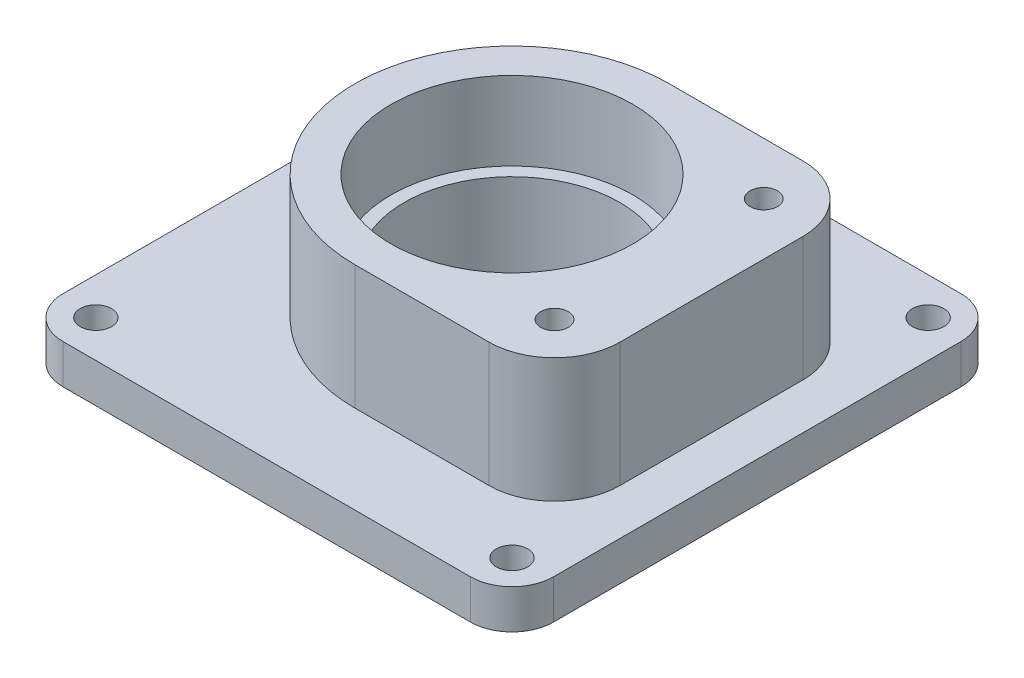
ISO-10303-21;
HEADER;
FILE_DESCRIPTION(('STEP AP214'),'2;1');
FILE_NAME('part.step','',(''),(''),'','','');
FILE_SCHEMA(('AUTOMOTIVE_DESIGN { 1 0 10303 214 1 1 1 1 }'));
ENDSEC;
DATA;
#1=APPLICATION_CONTEXT('core data for automotive mechanical design processes');
#2=APPLICATION_PROTOCOL_DEFINITION('international standard','automotive_design',2000,#1);
#3=PRODUCT_CONTEXT('',#1,'mechanical');
#4=PRODUCT('Part','Part','',(#3));
#5=PRODUCT_RELATED_PRODUCT_CATEGORY('part','',(#4));
#6=PRODUCT_DEFINITION_FORMATION('','',#4);
#7=PRODUCT_DEFINITION_CONTEXT('part definition',#1,'design');
#8=PRODUCT_DEFINITION('design','',#6,#7);
#9=PRODUCT_DEFINITION_SHAPE('','',#8);
#10=(LENGTH_UNIT() NAMED_UNIT(*) SI_UNIT(.MILLI.,.METRE.));
#11=(NAMED_UNIT(*) PLANE_ANGLE_UNIT() SI_UNIT($,.RADIAN.));
#12=(NAMED_UNIT(*) SI_UNIT($,.STERADIAN.) SOLID_ANGLE_UNIT());
#13=UNCERTAINTY_MEASURE_WITH_UNIT(LENGTH_MEASURE(1.E-05),#10,'distance_accuracy_value','');
#14=(GEOMETRIC_REPRESENTATION_CONTEXT(3) GLOBAL_UNCERTAINTY_ASSIGNED_CONTEXT((#13)) GLOBAL_UNIT_ASSIGNED_CONTEXT((#10,
#11,#12)) REPRESENTATION_CONTEXT('',''));
#15=CARTESIAN_POINT('',(0.,0.,0.));
#16=DIRECTION('',(0.,0.,1.));
#17=DIRECTION('',(1.,0.,0.));
#18=AXIS2_PLACEMENT_3D('',#15,#16,#17);
#19=CARTESIAN_POINT('',(-16.5,0.,0.));
#20=DIRECTION('',(0.,1.,0.));
#21=DIRECTION('',(0.,0.,1.));
#22=AXIS2_PLACEMENT_3D('',#19,#20,#21);
#23=PLANE('',#22);
#24=CARTESIAN_POINT('',(0.,0.,0.));
#25=DIRECTION('',(0.,-1.,0.));
#26=DIRECTION('',(0.,0.,-1.));
#27=AXIS2_PLACEMENT_3D('',#24,#25,#26);
#28=CIRCLE('',#27,16.5);
#29=CARTESIAN_POINT('',(0.,0.,-16.5));
#30=VERTEX_POINT('',#29);
#31=EDGE_CURVE('E242',#30,#30,#28,.T.);
#32=ORIENTED_EDGE('',*,*,#31,.F.);
#33=EDGE_LOOP('',(#32));
#34=FACE_BOUND('',#33,.T.);
#35=DIRECTION('',(0.,0.,1.));
#36=VECTOR('',#35,1.);
#37=CARTESIAN_POINT('',(37.5,0.,37.5));
#38=LINE('',#37,#36);
#39=CARTESIAN_POINT('',(37.5,0.,-31.15));
#40=VERTEX_POINT('',#39);
#41=CARTESIAN_POINT('',(37.5,0.,31.15));
#42=VERTEX_POINT('',#41);
#43=EDGE_CURVE('E244',#40,#42,#38,.T.);
#44=ORIENTED_EDGE('',*,*,#43,.T.);
#45=CARTESIAN_POINT('',(31.15,0.,31.15));
#46=DIRECTION('',(0.,1.,0.));
#47=DIRECTION('',(0.,0.,1.));
#48=AXIS2_PLACEMENT_3D('',#45,#46,#47);
#49=CIRCLE('',#48,6.35);
#50=CARTESIAN_POINT('',(31.15,0.,37.5));
#51=VERTEX_POINT('',#50);
#52=EDGE_CURVE('E328',#42,#51,#49,.F.);
#53=ORIENTED_EDGE('',*,*,#52,.T.);
#54=DIRECTION('',(-1.,0.,0.));
#55=VECTOR('',#54,1.);
#56=CARTESIAN_POINT('',(37.5,0.,37.5));
#57=LINE('',#56,#55);
#58=CARTESIAN_POINT('',(-31.15,0.,37.5));
#59=VERTEX_POINT('',#58);
#60=EDGE_CURVE('E238',#51,#59,#57,.T.);
#61=ORIENTED_EDGE('',*,*,#60,.T.);
#62=CARTESIAN_POINT('',(-31.15,0.,31.15));
#63=DIRECTION('',(0.,1.,0.));
#64=DIRECTION('',(0.,0.,1.));
#65=AXIS2_PLACEMENT_3D('',#62,#63,#64);
#66=CIRCLE('',#65,6.35);
#67=CARTESIAN_POINT('',(-37.5,0.,31.15));
#68=VERTEX_POINT('',#67);
#69=EDGE_CURVE('E325',#59,#68,#66,.F.);
#70=ORIENTED_EDGE('',*,*,#69,.T.);
#71=DIRECTION('',(0.,0.,-1.));
#72=VECTOR('',#71,1.);
#73=CARTESIAN_POINT('',(-37.5,0.,37.5));
#74=LINE('',#73,#72);
#75=CARTESIAN_POINT('',(-37.5,0.,-31.15));
#76=VERTEX_POINT('',#75);
#77=EDGE_CURVE('E243',#68,#76,#74,.T.);
#78=ORIENTED_EDGE('',*,*,#77,.T.);
#79=CARTESIAN_POINT('',(-31.15,0.,-31.15));
#80=DIRECTION('',(0.,1.,0.));
#81=DIRECTION('',(0.,0.,1.));
#82=AXIS2_PLACEMENT_3D('',#79,#80,#81);
#83=CIRCLE('',#82,6.35);
#84=CARTESIAN_POINT('',(-31.15,0.,-37.5));
#85=VERTEX_POINT('',#84);
#86=EDGE_CURVE('E319',#76,#85,#83,.F.);
#87=ORIENTED_EDGE('',*,*,#86,.T.);
#88=DIRECTION('',(1.,0.,0.));
#89=VECTOR('',#88,1.);
#90=CARTESIAN_POINT('',(37.5,0.,-37.5));
#91=LINE('',#90,#89);
#92=CARTESIAN_POINT('',(31.15,0.,-37.5));
#93=VERTEX_POINT('',#92);
#94=EDGE_CURVE('E248',#85,#93,#91,.T.);
#95=ORIENTED_EDGE('',*,*,#94,.T.);
#96=CARTESIAN_POINT('',(31.15,0.,-31.15));
#97=DIRECTION('',(0.,1.,0.));
#98=DIRECTION('',(0.,0.,1.));
#99=AXIS2_PLACEMENT_3D('',#96,#97,#98);
#100=CIRCLE('',#99,6.35);
#101=EDGE_CURVE('E322',#93,#40,#100,.F.);
#102=ORIENTED_EDGE('',*,*,#101,.T.);
#103=EDGE_LOOP('',(#44,#53,#61,#70,#78,#87,#95,#102));
#104=FACE_BOUND('',#103,.T.);
#105=CARTESIAN_POINT('',(31.8198051533946,0.,31.8198051533946));
#106=DIRECTION('',(0.,-1.,0.));
#107=DIRECTION('',(0.,0.,-1.));
#108=AXIS2_PLACEMENT_3D('',#105,#106,#107);
#109=CIRCLE('',#108,2.4);
#110=CARTESIAN_POINT('',(31.8198051533946,0.,29.4198051533946));
#111=VERTEX_POINT('',#110);
#112=EDGE_CURVE('E229',#111,#111,#109,.T.);
#113=ORIENTED_EDGE('',*,*,#112,.F.);
#114=EDGE_LOOP('',(#113));
#115=FACE_BOUND('',#114,.T.);
#116=CARTESIAN_POINT('',(-31.8198051533947,0.,31.8198051533946));
#117=DIRECTION('',(0.,-1.,0.));
#118=DIRECTION('',(0.,0.,-1.));
#119=AXIS2_PLACEMENT_3D('',#116,#117,#118);
#120=CIRCLE('',#119,2.4);
#121=CARTESIAN_POINT('',(-31.8198051533947,0.,29.4198051533946));
#122=VERTEX_POINT('',#121);
#123=EDGE_CURVE('E221',#122,#122,#120,.T.);
#124=ORIENTED_EDGE('',*,*,#123,.F.);
#125=EDGE_LOOP('',(#124));
#126=FACE_BOUND('',#125,.T.);
#127=CARTESIAN_POINT('',(-31.8198051533947,0.,-31.8198051533946));
#128=DIRECTION('',(0.,-1.,0.));
#129=DIRECTION('',(0.,0.,-1.));
#130=AXIS2_PLACEMENT_3D('',#127,#128,#129);
#131=CIRCLE('',#130,2.4);
#132=CARTESIAN_POINT('',(-31.8198051533947,0.,-34.2198051533946));
#133=VERTEX_POINT('',#132);
#134=EDGE_CURVE('E213',#133,#133,#131,.T.);
#135=ORIENTED_EDGE('',*,*,#134,.F.);
#136=EDGE_LOOP('',(#135));
#137=FACE_BOUND('',#136,.T.);
#138=CARTESIAN_POINT('',(31.8198051533946,0.,-31.8198051533946));
#139=DIRECTION('',(0.,-1.,0.));
#140=DIRECTION('',(0.,0.,-1.));
#141=AXIS2_PLACEMENT_3D('',#138,#139,#140);
#142=CIRCLE('',#141,2.4);
#143=CARTESIAN_POINT('',(31.8198051533946,0.,-34.2198051533946));
#144=VERTEX_POINT('',#143);
#145=EDGE_CURVE('E180',#144,#144,#142,.T.);
#146=ORIENTED_EDGE('',*,*,#145,.F.);
#147=EDGE_LOOP('',(#146));
#148=FACE_BOUND('',#147,.T.);
#149=ADVANCED_FACE('F45',(#34,#104,#115,#126,#137,#148),#23,.F.);
#150=CARTESIAN_POINT('',(-34.,6.,0.));
#151=DIRECTION('',(0.,-1.,0.));
#152=DIRECTION('',(0.,0.,-1.));
#153=AXIS2_PLACEMENT_3D('',#150,#151,#152);
#154=PLANE('',#153);
#155=CARTESIAN_POINT('',(31.8198051533946,6.,-31.8198051533946));
#156=DIRECTION('',(0.,-1.,0.));
#157=DIRECTION('',(0.,0.,-1.));
#158=AXIS2_PLACEMENT_3D('',#155,#156,#157);
#159=CIRCLE('',#158,2.4);
#160=CARTESIAN_POINT('',(31.8198051533946,6.,-34.2198051533946));
#161=VERTEX_POINT('',#160);
#162=EDGE_CURVE('E209',#161,#161,#159,.T.);
#163=ORIENTED_EDGE('',*,*,#162,.T.);
#164=EDGE_LOOP('',(#163));
#165=FACE_BOUND('',#164,.T.);
#166=CARTESIAN_POINT('',(-31.8198051533947,6.,-31.8198051533946));
#167=DIRECTION('',(0.,-1.,0.));
#168=DIRECTION('',(0.,0.,-1.));
#169=AXIS2_PLACEMENT_3D('',#166,#167,#168);
#170=CIRCLE('',#169,2.4);
#171=CARTESIAN_POINT('',(-31.8198051533947,6.,-34.2198051533946));
#172=VERTEX_POINT('',#171);
#173=EDGE_CURVE('E217',#172,#172,#170,.T.);
#174=ORIENTED_EDGE('',*,*,#173,.T.);
#175=EDGE_LOOP('',(#174));
#176=FACE_BOUND('',#175,.T.);
#177=CARTESIAN_POINT('',(-31.8198051533947,6.,31.8198051533946));
#178=DIRECTION('',(0.,-1.,0.));
#179=DIRECTION('',(0.,0.,-1.));
#180=AXIS2_PLACEMENT_3D('',#177,#178,#179);
#181=CIRCLE('',#180,2.4);
#182=CARTESIAN_POINT('',(-31.8198051533947,6.,29.4198051533946));
#183=VERTEX_POINT('',#182);
#184=EDGE_CURVE('E225',#183,#183,#181,.T.);
#185=ORIENTED_EDGE('',*,*,#184,.T.);
#186=EDGE_LOOP('',(#185));
#187=FACE_BOUND('',#186,.T.);
#188=CARTESIAN_POINT('',(31.8198051533946,6.,31.8198051533946));
#189=DIRECTION('',(0.,-1.,0.));
#190=DIRECTION('',(0.,0.,-1.));
#191=AXIS2_PLACEMENT_3D('',#188,#189,#190);
#192=CIRCLE('',#191,2.4);
#193=CARTESIAN_POINT('',(31.8198051533946,6.,29.4198051533946));
#194=VERTEX_POINT('',#193);
#195=EDGE_CURVE('E233',#194,#194,#192,.T.);
#196=ORIENTED_EDGE('',*,*,#195,.T.);
#197=EDGE_LOOP('',(#196));
#198=FACE_BOUND('',#197,.T.);
#199=CARTESIAN_POINT('',(0.,6.,0.));
#200=DIRECTION('',(0.,-1.,0.));
#201=DIRECTION('',(0.,0.,-1.));
#202=AXIS2_PLACEMENT_3D('',#199,#200,#201);
#203=CIRCLE('',#202,24.);
#204=CARTESIAN_POINT('',(0.,6.,24.));
#205=VERTEX_POINT('',#204);
#206=CARTESIAN_POINT('',(0.,6.,-24.));
#207=VERTEX_POINT('',#206);
#208=EDGE_CURVE('E289',#205,#207,#203,.T.);
#209=ORIENTED_EDGE('',*,*,#208,.T.);
#210=DIRECTION('',(-1.,0.,0.));
#211=VECTOR('',#210,1.);
#212=CARTESIAN_POINT('',(0.,6.00000000000001,-24.));
#213=LINE('',#212,#211);
#214=CARTESIAN_POINT('',(20.5,6.00000000000001,-24.));
#215=VERTEX_POINT('',#214);
#216=EDGE_CURVE('E194',#215,#207,#213,.T.);
#217=ORIENTED_EDGE('',*,*,#216,.F.);
#218=CARTESIAN_POINT('',(20.5,6.00000000000001,-14.));
#219=DIRECTION('',(0.,-1.,0.));
#220=DIRECTION('',(0.,0.,-1.));
#221=AXIS2_PLACEMENT_3D('',#218,#219,#220);
#222=CIRCLE('',#221,10.);
#223=CARTESIAN_POINT('',(30.5,6.00000000000001,-14.));
#224=VERTEX_POINT('',#223);
#225=EDGE_CURVE('E11',#215,#224,#222,.T.);
#226=ORIENTED_EDGE('',*,*,#225,.T.);
#227=DIRECTION('',(0.,0.,-1.));
#228=VECTOR('',#227,1.);
#229=CARTESIAN_POINT('',(30.5,6.00000000000001,-24.));
#230=LINE('',#229,#228);
#231=CARTESIAN_POINT('',(30.5,6.00000000000001,14.));
#232=VERTEX_POINT('',#231);
#233=EDGE_CURVE('E193',#232,#224,#230,.T.);
#234=ORIENTED_EDGE('',*,*,#233,.F.);
#235=CARTESIAN_POINT('',(20.5,6.00000000000001,14.));
#236=DIRECTION('',(0.,-1.,0.));
#237=DIRECTION('',(0.,0.,-1.));
#238=AXIS2_PLACEMENT_3D('',#235,#236,#237);
#239=CIRCLE('',#238,10.);
#240=CARTESIAN_POINT('',(20.5,6.00000000000001,24.));
#241=VERTEX_POINT('',#240);
#242=EDGE_CURVE('E54',#232,#241,#239,.T.);
#243=ORIENTED_EDGE('',*,*,#242,.T.);
#244=DIRECTION('',(1.,0.,0.));
#245=VECTOR('',#244,1.);
#246=CARTESIAN_POINT('',(30.5,6.00000000000001,24.));
#247=LINE('',#246,#245);
#248=EDGE_CURVE('E189',#205,#241,#247,.T.);
#249=ORIENTED_EDGE('',*,*,#248,.F.);
#250=EDGE_LOOP('',(#209,#217,#226,#234,#243,#249));
#251=FACE_BOUND('',#250,.T.);
#252=DIRECTION('',(1.,0.,0.));
#253=VECTOR('',#252,1.);
#254=CARTESIAN_POINT('',(37.5,6.,37.5));
#255=LINE('',#254,#253);
#256=CARTESIAN_POINT('',(-31.15,6.,37.5));
#257=VERTEX_POINT('',#256);
#258=CARTESIAN_POINT('',(31.15,6.,37.5));
#259=VERTEX_POINT('',#258);
#260=EDGE_CURVE('E259',#257,#259,#255,.T.);
#261=ORIENTED_EDGE('',*,*,#260,.T.);
#262=CARTESIAN_POINT('',(31.15,6.00000000000001,31.15));
#263=DIRECTION('',(0.,-1.,0.));
#264=DIRECTION('',(0.,0.,-1.));
#265=AXIS2_PLACEMENT_3D('',#262,#263,#264);
#266=CIRCLE('',#265,6.35);
#267=CARTESIAN_POINT('',(37.5,6.,31.15));
#268=VERTEX_POINT('',#267);
#269=EDGE_CURVE('E309',#259,#268,#266,.F.);
#270=ORIENTED_EDGE('',*,*,#269,.T.);
#271=DIRECTION('',(0.,0.,-1.));
#272=VECTOR('',#271,1.);
#273=CARTESIAN_POINT('',(37.5,6.,37.5));
#274=LINE('',#273,#272);
#275=CARTESIAN_POINT('',(37.5,6.,-31.15));
#276=VERTEX_POINT('',#275);
#277=EDGE_CURVE('E263',#268,#276,#274,.T.);
#278=ORIENTED_EDGE('',*,*,#277,.T.);
#279=CARTESIAN_POINT('',(31.15,6.00000000000001,-31.15));
#280=DIRECTION('',(0.,-1.,0.));
#281=DIRECTION('',(0.,0.,-1.));
#282=AXIS2_PLACEMENT_3D('',#279,#280,#281);
#283=CIRCLE('',#282,6.35);
#284=CARTESIAN_POINT('',(31.15,6.,-37.5));
#285=VERTEX_POINT('',#284);
#286=EDGE_CURVE('E303',#276,#285,#283,.F.);
#287=ORIENTED_EDGE('',*,*,#286,.T.);
#288=DIRECTION('',(-1.,0.,0.));
#289=VECTOR('',#288,1.);
#290=CARTESIAN_POINT('',(37.5,6.,-37.5));
#291=LINE('',#290,#289);
#292=CARTESIAN_POINT('',(-31.15,6.,-37.5));
#293=VERTEX_POINT('',#292);
#294=EDGE_CURVE('E249',#285,#293,#291,.T.);
#295=ORIENTED_EDGE('',*,*,#294,.T.);
#296=CARTESIAN_POINT('',(-31.15,6.00000000000001,-31.15));
#297=DIRECTION('',(0.,-1.,0.));
#298=DIRECTION('',(0.,0.,-1.));
#299=AXIS2_PLACEMENT_3D('',#296,#297,#298);
#300=CIRCLE('',#299,6.35);
#301=CARTESIAN_POINT('',(-37.5,6.,-31.15));
#302=VERTEX_POINT('',#301);
#303=EDGE_CURVE('E300',#293,#302,#300,.F.);
#304=ORIENTED_EDGE('',*,*,#303,.T.);
#305=DIRECTION('',(0.,0.,1.));
#306=VECTOR('',#305,1.);
#307=CARTESIAN_POINT('',(-37.5,6.,37.5));
#308=LINE('',#307,#306);
#309=CARTESIAN_POINT('',(-37.5,6.,31.15));
#310=VERTEX_POINT('',#309);
#311=EDGE_CURVE('E237',#302,#310,#308,.T.);
#312=ORIENTED_EDGE('',*,*,#311,.T.);
#313=CARTESIAN_POINT('',(-31.15,6.00000000000001,31.15));
#314=DIRECTION('',(0.,-1.,0.));
#315=DIRECTION('',(0.,0.,-1.));
#316=AXIS2_PLACEMENT_3D('',#313,#314,#315);
#317=CIRCLE('',#316,6.35);
#318=EDGE_CURVE('E306',#310,#257,#317,.F.);
#319=ORIENTED_EDGE('',*,*,#318,.T.);
#320=EDGE_LOOP('',(#261,#270,#278,#287,#295,#304,#312,#319));
#321=FACE_BOUND('',#320,.T.);
#322=ADVANCED_FACE('F365',(#165,#176,#187,#198,#251,#321),#154,.F.);
#323=CARTESIAN_POINT('',(0.,0.,0.));
#324=DIRECTION('',(0.,-1.,0.));
#325=DIRECTION('',(0.,0.,-1.));
#326=AXIS2_PLACEMENT_3D('',#323,#324,#325);
#327=CYLINDRICAL_SURFACE('',#326,24.);
#328=CARTESIAN_POINT('',(0.,25.,0.));
#329=DIRECTION('',(0.,-1.,0.));
#330=DIRECTION('',(0.,0.,-1.));
#331=AXIS2_PLACEMENT_3D('',#328,#329,#330);
#332=CIRCLE('',#331,24.);
#333=CARTESIAN_POINT('',(0.,25.,24.));
#334=VERTEX_POINT('',#333);
#335=CARTESIAN_POINT('',(0.,25.,-24.));
#336=VERTEX_POINT('',#335);
#337=EDGE_CURVE('E285',#334,#336,#332,.T.);
#338=ORIENTED_EDGE('',*,*,#337,.T.);
#339=DIRECTION('',(0.,1.,0.));
#340=VECTOR('',#339,1.);
#341=CARTESIAN_POINT('',(0.,-66.624031835199,-24.));
#342=LINE('',#341,#340);
#343=EDGE_CURVE('E197',#207,#336,#342,.T.);
#344=ORIENTED_EDGE('',*,*,#343,.F.);
#345=ORIENTED_EDGE('',*,*,#208,.F.);
#346=DIRECTION('',(0.,1.,0.));
#347=VECTOR('',#346,1.);
#348=CARTESIAN_POINT('',(0.,-66.624031835199,24.));
#349=LINE('',#348,#347);
#350=EDGE_CURVE('E176',#205,#334,#349,.T.);
#351=ORIENTED_EDGE('',*,*,#350,.T.);
#352=EDGE_LOOP('',(#338,#344,#345,#351));
#353=FACE_BOUND('',#352,.T.);
#354=ADVANCED_FACE('F387',(#353),#327,.T.);
#355=CARTESIAN_POINT('',(-24.,25.,0.));
#356=DIRECTION('',(0.,-1.,0.));
#357=DIRECTION('',(0.,0.,-1.));
#358=AXIS2_PLACEMENT_3D('',#355,#356,#357);
#359=PLANE('',#358);
#360=CARTESIAN_POINT('',(22.5,25.,-16.));
#361=DIRECTION('',(0.,1.,0.));
#362=DIRECTION('',(0.,0.,1.));
#363=AXIS2_PLACEMENT_3D('',#360,#361,#362);
#364=CIRCLE('',#363,2.1);
#365=CARTESIAN_POINT('',(22.5,25.,-13.9));
#366=VERTEX_POINT('',#365);
#367=EDGE_CURVE('E163',#366,#366,#364,.T.);
#368=ORIENTED_EDGE('',*,*,#367,.F.);
#369=EDGE_LOOP('',(#368));
#370=FACE_BOUND('',#369,.T.);
#371=CARTESIAN_POINT('',(22.5,25.,16.));
#372=DIRECTION('',(0.,1.,0.));
#373=DIRECTION('',(0.,0.,1.));
#374=AXIS2_PLACEMENT_3D('',#371,#372,#373);
#375=CIRCLE('',#374,2.1);
#376=CARTESIAN_POINT('',(22.5,25.,18.1));
#377=VERTEX_POINT('',#376);
#378=EDGE_CURVE('E162',#377,#377,#375,.T.);
#379=ORIENTED_EDGE('',*,*,#378,.F.);
#380=EDGE_LOOP('',(#379));
#381=FACE_BOUND('',#380,.T.);
#382=DIRECTION('',(1.,0.,0.));
#383=VECTOR('',#382,1.);
#384=CARTESIAN_POINT('',(30.5,25.,24.));
#385=LINE('',#384,#383);
#386=CARTESIAN_POINT('',(20.5,25.,24.));
#387=VERTEX_POINT('',#386);
#388=EDGE_CURVE('E185',#334,#387,#385,.T.);
#389=ORIENTED_EDGE('',*,*,#388,.T.);
#390=CARTESIAN_POINT('',(20.5,25.,14.));
#391=DIRECTION('',(0.,-1.,0.));
#392=DIRECTION('',(0.,0.,-1.));
#393=AXIS2_PLACEMENT_3D('',#390,#391,#392);
#394=CIRCLE('',#393,10.);
#395=CARTESIAN_POINT('',(30.5,25.,14.));
#396=VERTEX_POINT('',#395);
#397=EDGE_CURVE('E352',#387,#396,#394,.F.);
#398=ORIENTED_EDGE('',*,*,#397,.T.);
#399=DIRECTION('',(0.,0.,-1.));
#400=VECTOR('',#399,1.);
#401=CARTESIAN_POINT('',(30.5,25.,-24.));
#402=LINE('',#401,#400);
#403=CARTESIAN_POINT('',(30.5,25.,-14.));
#404=VERTEX_POINT('',#403);
#405=EDGE_CURVE('E181',#396,#404,#402,.T.);
#406=ORIENTED_EDGE('',*,*,#405,.T.);
#407=CARTESIAN_POINT('',(20.5,25.,-14.));
#408=DIRECTION('',(0.,-1.,0.));
#409=DIRECTION('',(0.,0.,-1.));
#410=AXIS2_PLACEMENT_3D('',#407,#408,#409);
#411=CIRCLE('',#410,10.);
#412=CARTESIAN_POINT('',(20.5,25.,-24.));
#413=VERTEX_POINT('',#412);
#414=EDGE_CURVE('E349',#404,#413,#411,.F.);
#415=ORIENTED_EDGE('',*,*,#414,.T.);
#416=DIRECTION('',(-1.,0.,0.));
#417=VECTOR('',#416,1.);
#418=CARTESIAN_POINT('',(0.,25.,-24.));
#419=LINE('',#418,#417);
#420=EDGE_CURVE('E177',#413,#336,#419,.T.);
#421=ORIENTED_EDGE('',*,*,#420,.T.);
#422=ORIENTED_EDGE('',*,*,#337,.F.);
#423=EDGE_LOOP('',(#389,#398,#406,#415,#421,#422));
#424=FACE_BOUND('',#423,.T.);
#425=CARTESIAN_POINT('',(0.,25.,0.));
#426=DIRECTION('',(0.,-1.,0.));
#427=DIRECTION('',(0.,0.,-1.));
#428=AXIS2_PLACEMENT_3D('',#425,#426,#427);
#429=CIRCLE('',#428,18.5);
#430=CARTESIAN_POINT('',(0.,25.,-18.5));
#431=VERTEX_POINT('',#430);
#432=EDGE_CURVE('E281',#431,#431,#429,.T.);
#433=ORIENTED_EDGE('',*,*,#432,.T.);
#434=EDGE_LOOP('',(#433));
#435=FACE_BOUND('',#434,.T.);
#436=ADVANCED_FACE('F378',(#370,#381,#424,#435),#359,.F.);
#437=CARTESIAN_POINT('',(0.,0.,0.));
#438=DIRECTION('',(0.,-1.,0.));
#439=DIRECTION('',(0.,0.,-1.));
#440=AXIS2_PLACEMENT_3D('',#437,#438,#439);
#441=CYLINDRICAL_SURFACE('',#440,18.5);
#442=ORIENTED_EDGE('',*,*,#432,.F.);
#443=EDGE_LOOP('',(#442));
#444=FACE_BOUND('',#443,.T.);
#445=CARTESIAN_POINT('',(0.,13.,0.));
#446=DIRECTION('',(0.,-1.,0.));
#447=DIRECTION('',(0.,0.,-1.));
#448=AXIS2_PLACEMENT_3D('',#445,#446,#447);
#449=CIRCLE('',#448,18.5);
#450=CARTESIAN_POINT('',(0.,13.,-18.5));
#451=VERTEX_POINT('',#450);
#452=EDGE_CURVE('E277',#451,#451,#449,.T.);
#453=ORIENTED_EDGE('',*,*,#452,.T.);
#454=EDGE_LOOP('',(#453));
#455=FACE_BOUND('',#454,.T.);
#456=ADVANCED_FACE('F394',(#444,#455),#441,.F.);
#457=CARTESIAN_POINT('',(-18.5,13.,0.));
#458=DIRECTION('',(0.,-1.,0.));
#459=DIRECTION('',(0.,0.,-1.));
#460=AXIS2_PLACEMENT_3D('',#457,#458,#459);
#461=PLANE('',#460);
#462=ORIENTED_EDGE('',*,*,#452,.F.);
#463=EDGE_LOOP('',(#462));
#464=FACE_BOUND('',#463,.T.);
#465=CARTESIAN_POINT('',(0.,13.,0.));
#466=DIRECTION('',(0.,-1.,0.));
#467=DIRECTION('',(0.,0.,-1.));
#468=AXIS2_PLACEMENT_3D('',#465,#466,#467);
#469=CIRCLE('',#468,16.5);
#470=CARTESIAN_POINT('',(0.,13.,-16.5));
#471=VERTEX_POINT('',#470);
#472=EDGE_CURVE('E273',#471,#471,#469,.T.);
#473=ORIENTED_EDGE('',*,*,#472,.T.);
#474=EDGE_LOOP('',(#473));
#475=FACE_BOUND('',#474,.T.);
#476=ADVANCED_FACE('F414',(#464,#475),#461,.F.);
#477=CARTESIAN_POINT('',(0.,0.,0.));
#478=DIRECTION('',(0.,-1.,0.));
#479=DIRECTION('',(0.,0.,-1.));
#480=AXIS2_PLACEMENT_3D('',#477,#478,#479);
#481=CYLINDRICAL_SURFACE('',#480,16.5);
#482=ORIENTED_EDGE('',*,*,#472,.F.);
#483=EDGE_LOOP('',(#482));
#484=FACE_BOUND('',#483,.T.);
#485=ORIENTED_EDGE('',*,*,#31,.T.);
#486=EDGE_LOOP('',(#485));
#487=FACE_BOUND('',#486,.T.);
#488=ADVANCED_FACE('F410',(#484,#487),#481,.F.);
#489=CARTESIAN_POINT('',(37.5,-106.066017177982,37.5));
#490=DIRECTION('',(0.,0.,1.));
#491=DIRECTION('',(1.,0.,0.));
#492=AXIS2_PLACEMENT_3D('',#489,#490,#491);
#493=PLANE('',#492);
#494=ORIENTED_EDGE('',*,*,#60,.F.);
#495=DIRECTION('',(0.,1.,0.));
#496=VECTOR('',#495,1.);
#497=CARTESIAN_POINT('',(31.15,-106.066017177982,37.5));
#498=LINE('',#497,#496);
#499=EDGE_CURVE('E296',#51,#259,#498,.T.);
#500=ORIENTED_EDGE('',*,*,#499,.T.);
#501=ORIENTED_EDGE('',*,*,#260,.F.);
#502=DIRECTION('',(0.,1.,0.));
#503=VECTOR('',#502,1.);
#504=CARTESIAN_POINT('',(-31.15,-106.066017177982,37.5));
#505=LINE('',#504,#503);
#506=EDGE_CURVE('E293',#257,#59,#505,.F.);
#507=ORIENTED_EDGE('',*,*,#506,.T.);
#508=EDGE_LOOP('',(#494,#500,#501,#507));
#509=FACE_BOUND('',#508,.T.);
#510=ADVANCED_FACE('F413',(#509),#493,.T.);
#511=CARTESIAN_POINT('',(37.5,-106.066017177982,37.5));
#512=DIRECTION('',(1.,0.,0.));
#513=DIRECTION('',(0.,0.,-1.));
#514=AXIS2_PLACEMENT_3D('',#511,#512,#513);
#515=PLANE('',#514);
#516=ORIENTED_EDGE('',*,*,#277,.F.);
#517=DIRECTION('',(0.,1.,0.));
#518=VECTOR('',#517,1.);
#519=CARTESIAN_POINT('',(37.5,-106.066017177982,31.15));
#520=LINE('',#519,#518);
#521=EDGE_CURVE('E316',#268,#42,#520,.F.);
#522=ORIENTED_EDGE('',*,*,#521,.T.);
#523=ORIENTED_EDGE('',*,*,#43,.F.);
#524=DIRECTION('',(0.,1.,0.));
#525=VECTOR('',#524,1.);
#526=CARTESIAN_POINT('',(37.5,-106.066017177982,-31.15));
#527=LINE('',#526,#525);
#528=EDGE_CURVE('E312',#40,#276,#527,.T.);
#529=ORIENTED_EDGE('',*,*,#528,.T.);
#530=EDGE_LOOP('',(#516,#522,#523,#529));
#531=FACE_BOUND('',#530,.T.);
#532=ADVANCED_FACE('F446',(#531),#515,.T.);
#533=CARTESIAN_POINT('',(37.5,-106.066017177982,-37.5));
#534=DIRECTION('',(0.,0.,-1.));
#535=DIRECTION('',(-1.,0.,0.));
#536=AXIS2_PLACEMENT_3D('',#533,#534,#535);
#537=PLANE('',#536);
#538=ORIENTED_EDGE('',*,*,#294,.F.);
#539=DIRECTION('',(0.,1.,0.));
#540=VECTOR('',#539,1.);
#541=CARTESIAN_POINT('',(31.15,-106.066017177982,-37.5));
#542=LINE('',#541,#540);
#543=EDGE_CURVE('E342',#285,#93,#542,.F.);
#544=ORIENTED_EDGE('',*,*,#543,.T.);
#545=ORIENTED_EDGE('',*,*,#94,.F.);
#546=DIRECTION('',(0.,1.,0.));
#547=VECTOR('',#546,1.);
#548=CARTESIAN_POINT('',(-31.15,-106.066017177982,-37.5));
#549=LINE('',#548,#547);
#550=EDGE_CURVE('E338',#85,#293,#549,.T.);
#551=ORIENTED_EDGE('',*,*,#550,.T.);
#552=EDGE_LOOP('',(#538,#544,#545,#551));
#553=FACE_BOUND('',#552,.T.);
#554=ADVANCED_FACE('F453',(#553),#537,.T.);
#555=CARTESIAN_POINT('',(-37.5,-106.066017177982,37.5));
#556=DIRECTION('',(-1.,0.,0.));
#557=DIRECTION('',(0.,0.,1.));
#558=AXIS2_PLACEMENT_3D('',#555,#556,#557);
#559=PLANE('',#558);
#560=ORIENTED_EDGE('',*,*,#77,.F.);
#561=DIRECTION('',(0.,1.,0.));
#562=VECTOR('',#561,1.);
#563=CARTESIAN_POINT('',(-37.5,-106.066017177982,31.15));
#564=LINE('',#563,#562);
#565=EDGE_CURVE('E334',#68,#310,#564,.T.);
#566=ORIENTED_EDGE('',*,*,#565,.T.);
#567=ORIENTED_EDGE('',*,*,#311,.F.);
#568=DIRECTION('',(0.,1.,0.));
#569=VECTOR('',#568,1.);
#570=CARTESIAN_POINT('',(-37.5,-106.066017177982,-31.15));
#571=LINE('',#570,#569);
#572=EDGE_CURVE('E331',#302,#76,#571,.F.);
#573=ORIENTED_EDGE('',*,*,#572,.T.);
#574=EDGE_LOOP('',(#560,#566,#567,#573));
#575=FACE_BOUND('',#574,.T.);
#576=ADVANCED_FACE('F408',(#575),#559,.T.);
#577=CARTESIAN_POINT('',(31.8198051533946,0.,31.8198051533946));
#578=DIRECTION('',(0.,-1.,0.));
#579=DIRECTION('',(0.,0.,-1.));
#580=AXIS2_PLACEMENT_3D('',#577,#578,#579);
#581=CYLINDRICAL_SURFACE('',#580,2.4);
#582=ORIENTED_EDGE('',*,*,#195,.F.);
#583=EDGE_LOOP('',(#582));
#584=FACE_BOUND('',#583,.T.);
#585=ORIENTED_EDGE('',*,*,#112,.T.);
#586=EDGE_LOOP('',(#585));
#587=FACE_BOUND('',#586,.T.);
#588=ADVANCED_FACE('F469',(#584,#587),#581,.F.);
#589=CARTESIAN_POINT('',(-31.8198051533947,0.,31.8198051533946));
#590=DIRECTION('',(0.,-1.,0.));
#591=DIRECTION('',(0.,0.,-1.));
#592=AXIS2_PLACEMENT_3D('',#589,#590,#591);
#593=CYLINDRICAL_SURFACE('',#592,2.4);
#594=ORIENTED_EDGE('',*,*,#184,.F.);
#595=EDGE_LOOP('',(#594));
#596=FACE_BOUND('',#595,.T.);
#597=ORIENTED_EDGE('',*,*,#123,.T.);
#598=EDGE_LOOP('',(#597));
#599=FACE_BOUND('',#598,.T.);
#600=ADVANCED_FACE('F475',(#596,#599),#593,.F.);
#601=CARTESIAN_POINT('',(-31.8198051533947,0.,-31.8198051533946));
#602=DIRECTION('',(0.,-1.,0.));
#603=DIRECTION('',(0.,0.,-1.));
#604=AXIS2_PLACEMENT_3D('',#601,#602,#603);
#605=CYLINDRICAL_SURFACE('',#604,2.4);
#606=ORIENTED_EDGE('',*,*,#173,.F.);
#607=EDGE_LOOP('',(#606));
#608=FACE_BOUND('',#607,.T.);
#609=ORIENTED_EDGE('',*,*,#134,.T.);
#610=EDGE_LOOP('',(#609));
#611=FACE_BOUND('',#610,.T.);
#612=ADVANCED_FACE('F483',(#608,#611),#605,.F.);
#613=CARTESIAN_POINT('',(31.8198051533946,0.,-31.8198051533946));
#614=DIRECTION('',(0.,-1.,0.));
#615=DIRECTION('',(0.,0.,-1.));
#616=AXIS2_PLACEMENT_3D('',#613,#614,#615);
#617=CYLINDRICAL_SURFACE('',#616,2.4);
#618=ORIENTED_EDGE('',*,*,#162,.F.);
#619=EDGE_LOOP('',(#618));
#620=FACE_BOUND('',#619,.T.);
#621=ORIENTED_EDGE('',*,*,#145,.T.);
#622=EDGE_LOOP('',(#621));
#623=FACE_BOUND('',#622,.T.);
#624=ADVANCED_FACE('F491',(#620,#623),#617,.F.);
#625=CARTESIAN_POINT('',(31.15,-106.066017177982,31.15));
#626=DIRECTION('',(0.,1.,0.));
#627=DIRECTION('',(0.,0.,1.));
#628=AXIS2_PLACEMENT_3D('',#625,#626,#627);
#629=CYLINDRICAL_SURFACE('',#628,6.35);
#630=ORIENTED_EDGE('',*,*,#52,.F.);
#631=ORIENTED_EDGE('',*,*,#521,.F.);
#632=ORIENTED_EDGE('',*,*,#269,.F.);
#633=ORIENTED_EDGE('',*,*,#499,.F.);
#634=EDGE_LOOP('',(#630,#631,#632,#633));
#635=FACE_BOUND('',#634,.T.);
#636=ADVANCED_FACE('F499',(#635),#629,.T.);
#637=CARTESIAN_POINT('',(-31.15,-106.066017177982,31.15));
#638=DIRECTION('',(0.,1.,0.));
#639=DIRECTION('',(0.,0.,1.));
#640=AXIS2_PLACEMENT_3D('',#637,#638,#639);
#641=CYLINDRICAL_SURFACE('',#640,6.35);
#642=ORIENTED_EDGE('',*,*,#69,.F.);
#643=ORIENTED_EDGE('',*,*,#506,.F.);
#644=ORIENTED_EDGE('',*,*,#318,.F.);
#645=ORIENTED_EDGE('',*,*,#565,.F.);
#646=EDGE_LOOP('',(#642,#643,#644,#645));
#647=FACE_BOUND('',#646,.T.);
#648=ADVANCED_FACE('F507',(#647),#641,.T.);
#649=CARTESIAN_POINT('',(31.15,-106.066017177982,-31.15));
#650=DIRECTION('',(0.,1.,0.));
#651=DIRECTION('',(0.,0.,1.));
#652=AXIS2_PLACEMENT_3D('',#649,#650,#651);
#653=CYLINDRICAL_SURFACE('',#652,6.35);
#654=ORIENTED_EDGE('',*,*,#101,.F.);
#655=ORIENTED_EDGE('',*,*,#543,.F.);
#656=ORIENTED_EDGE('',*,*,#286,.F.);
#657=ORIENTED_EDGE('',*,*,#528,.F.);
#658=EDGE_LOOP('',(#654,#655,#656,#657));
#659=FACE_BOUND('',#658,.T.);
#660=ADVANCED_FACE('F515',(#659),#653,.T.);
#661=CARTESIAN_POINT('',(-31.15,-106.066017177982,-31.15));
#662=DIRECTION('',(0.,1.,0.));
#663=DIRECTION('',(0.,0.,1.));
#664=AXIS2_PLACEMENT_3D('',#661,#662,#663);
#665=CYLINDRICAL_SURFACE('',#664,6.35);
#666=ORIENTED_EDGE('',*,*,#86,.F.);
#667=ORIENTED_EDGE('',*,*,#572,.F.);
#668=ORIENTED_EDGE('',*,*,#303,.F.);
#669=ORIENTED_EDGE('',*,*,#550,.F.);
#670=EDGE_LOOP('',(#666,#667,#668,#669));
#671=FACE_BOUND('',#670,.T.);
#672=ADVANCED_FACE('F523',(#671),#665,.T.);
#673=CARTESIAN_POINT('',(0.,-66.624031835199,-24.));
#674=DIRECTION('',(0.,0.,-1.));
#675=DIRECTION('',(-1.,0.,0.));
#676=AXIS2_PLACEMENT_3D('',#673,#674,#675);
#677=PLANE('',#676);
#678=ORIENTED_EDGE('',*,*,#420,.F.);
#679=DIRECTION('',(0.,1.,0.));
#680=VECTOR('',#679,1.);
#681=CARTESIAN_POINT('',(20.5,-66.624031835199,-24.));
#682=LINE('',#681,#680);
#683=EDGE_CURVE('E61',#413,#215,#682,.F.);
#684=ORIENTED_EDGE('',*,*,#683,.T.);
#685=ORIENTED_EDGE('',*,*,#216,.T.);
#686=ORIENTED_EDGE('',*,*,#343,.T.);
#687=EDGE_LOOP('',(#678,#684,#685,#686));
#688=FACE_BOUND('',#687,.T.);
#689=ADVANCED_FACE('F384',(#688),#677,.T.);
#690=CARTESIAN_POINT('',(30.5,-66.624031835199,-24.));
#691=DIRECTION('',(1.,0.,0.));
#692=DIRECTION('',(0.,0.,-1.));
#693=AXIS2_PLACEMENT_3D('',#690,#691,#692);
#694=PLANE('',#693);
#695=ORIENTED_EDGE('',*,*,#405,.F.);
#696=DIRECTION('',(0.,1.,0.));
#697=VECTOR('',#696,1.);
#698=CARTESIAN_POINT('',(30.5,-66.624031835199,14.));
#699=LINE('',#698,#697);
#700=EDGE_CURVE('E359',#396,#232,#699,.F.);
#701=ORIENTED_EDGE('',*,*,#700,.T.);
#702=ORIENTED_EDGE('',*,*,#233,.T.);
#703=DIRECTION('',(0.,1.,0.));
#704=VECTOR('',#703,1.);
#705=CARTESIAN_POINT('',(30.5,-66.624031835199,-14.));
#706=LINE('',#705,#704);
#707=EDGE_CURVE('E355',#224,#404,#706,.T.);
#708=ORIENTED_EDGE('',*,*,#707,.T.);
#709=EDGE_LOOP('',(#695,#701,#702,#708));
#710=FACE_BOUND('',#709,.T.);
#711=ADVANCED_FACE('F381',(#710),#694,.T.);
#712=CARTESIAN_POINT('',(30.5,-66.624031835199,24.));
#713=DIRECTION('',(0.,0.,1.));
#714=DIRECTION('',(1.,0.,0.));
#715=AXIS2_PLACEMENT_3D('',#712,#713,#714);
#716=PLANE('',#715);
#717=ORIENTED_EDGE('',*,*,#248,.T.);
#718=DIRECTION('',(0.,1.,0.));
#719=VECTOR('',#718,1.);
#720=CARTESIAN_POINT('',(20.5,-66.624031835199,24.));
#721=LINE('',#720,#719);
#722=EDGE_CURVE('E345',#241,#387,#721,.T.);
#723=ORIENTED_EDGE('',*,*,#722,.T.);
#724=ORIENTED_EDGE('',*,*,#388,.F.);
#725=ORIENTED_EDGE('',*,*,#350,.F.);
#726=EDGE_LOOP('',(#717,#723,#724,#725));
#727=FACE_BOUND('',#726,.T.);
#728=ADVANCED_FACE('F373',(#727),#716,.T.);
#729=CARTESIAN_POINT('',(20.5,-66.624031835199,14.));
#730=DIRECTION('',(0.,1.,0.));
#731=DIRECTION('',(0.,0.,1.));
#732=AXIS2_PLACEMENT_3D('',#729,#730,#731);
#733=CYLINDRICAL_SURFACE('',#732,10.);
#734=ORIENTED_EDGE('',*,*,#242,.F.);
#735=ORIENTED_EDGE('',*,*,#700,.F.);
#736=ORIENTED_EDGE('',*,*,#397,.F.);
#737=ORIENTED_EDGE('',*,*,#722,.F.);
#738=EDGE_LOOP('',(#734,#735,#736,#737));
#739=FACE_BOUND('',#738,.T.);
#740=ADVANCED_FACE('F375',(#739),#733,.T.);
#741=CARTESIAN_POINT('',(20.5,-66.624031835199,-14.));
#742=DIRECTION('',(0.,1.,0.));
#743=DIRECTION('',(0.,0.,1.));
#744=AXIS2_PLACEMENT_3D('',#741,#742,#743);
#745=CYLINDRICAL_SURFACE('',#744,10.);
#746=ORIENTED_EDGE('',*,*,#225,.F.);
#747=ORIENTED_EDGE('',*,*,#683,.F.);
#748=ORIENTED_EDGE('',*,*,#414,.F.);
#749=ORIENTED_EDGE('',*,*,#707,.F.);
#750=EDGE_LOOP('',(#746,#747,#748,#749));
#751=FACE_BOUND('',#750,.T.);
#752=ADVANCED_FACE('F47',(#751),#745,.T.);
#753=CARTESIAN_POINT('',(22.5,12.6,16.));
#754=DIRECTION('',(0.,1.,0.));
#755=DIRECTION('',(0.,0.,1.));
#756=AXIS2_PLACEMENT_3D('',#753,#754,#755);
#757=CONICAL_SURFACE('',#756,2.1,1.02974425867665);
#758=CARTESIAN_POINT('',(22.5,11.3381927000421,16.));
#759=VERTEX_POINT('',#758);
#760=VERTEX_LOOP('',#759);
#761=FACE_BOUND('',#760,.T.);
#762=CARTESIAN_POINT('',(22.5,12.6,16.));
#763=DIRECTION('',(0.,1.,0.));
#764=DIRECTION('',(0.,0.,1.));
#765=AXIS2_PLACEMENT_3D('',#762,#763,#764);
#766=CIRCLE('',#765,2.1);
#767=CARTESIAN_POINT('',(22.5,12.6,18.1));
#768=VERTEX_POINT('',#767);
#769=EDGE_CURVE('E168',#768,#768,#766,.T.);
#770=ORIENTED_EDGE('',*,*,#769,.T.);
#771=EDGE_LOOP('',(#770));
#772=FACE_BOUND('',#771,.T.);
#773=ADVANCED_FACE('F562',(#761,#772),#757,.F.);
#774=CARTESIAN_POINT('',(22.5,25.,16.));
#775=DIRECTION('',(0.,1.,0.));
#776=DIRECTION('',(0.,0.,1.));
#777=AXIS2_PLACEMENT_3D('',#774,#775,#776);
#778=CYLINDRICAL_SURFACE('',#777,2.1);
#779=ORIENTED_EDGE('',*,*,#769,.F.);
#780=EDGE_LOOP('',(#779));
#781=FACE_BOUND('',#780,.T.);
#782=ORIENTED_EDGE('',*,*,#378,.T.);
#783=EDGE_LOOP('',(#782));
#784=FACE_BOUND('',#783,.T.);
#785=ADVANCED_FACE('F155',(#781,#784),#778,.F.);
#786=CARTESIAN_POINT('',(22.5,12.6,-16.));
#787=DIRECTION('',(0.,1.,0.));
#788=DIRECTION('',(0.,0.,1.));
#789=AXIS2_PLACEMENT_3D('',#786,#787,#788);
#790=CONICAL_SURFACE('',#789,2.1,1.02974425867665);
#791=CARTESIAN_POINT('',(22.5,11.3381927000421,-16.));
#792=VERTEX_POINT('',#791);
#793=VERTEX_LOOP('',#792);
#794=FACE_BOUND('',#793,.T.);
#795=CARTESIAN_POINT('',(22.5,12.6,-16.));
#796=DIRECTION('',(0.,1.,0.));
#797=DIRECTION('',(0.,0.,1.));
#798=AXIS2_PLACEMENT_3D('',#795,#796,#797);
#799=CIRCLE('',#798,2.1);
#800=CARTESIAN_POINT('',(22.5,12.6,-13.9));
#801=VERTEX_POINT('',#800);
#802=EDGE_CURVE('E159',#801,#801,#799,.T.);
#803=ORIENTED_EDGE('',*,*,#802,.T.);
#804=EDGE_LOOP('',(#803));
#805=FACE_BOUND('',#804,.T.);
#806=ADVANCED_FACE('F151',(#794,#805),#790,.F.);
#807=CARTESIAN_POINT('',(22.5,25.,-16.));
#808=DIRECTION('',(0.,1.,0.));
#809=DIRECTION('',(0.,0.,1.));
#810=AXIS2_PLACEMENT_3D('',#807,#808,#809);
#811=CYLINDRICAL_SURFACE('',#810,2.1);
#812=ORIENTED_EDGE('',*,*,#802,.F.);
#813=EDGE_LOOP('',(#812));
#814=FACE_BOUND('',#813,.T.);
#815=ORIENTED_EDGE('',*,*,#367,.T.);
#816=EDGE_LOOP('',(#815));
#817=FACE_BOUND('',#816,.T.);
#818=ADVANCED_FACE('F154',(#814,#817),#811,.F.);
#819=CLOSED_SHELL('',(#149,#322,#354,#436,#456,#476,#488,#510,#532,#554,#576,#588,#600,#612,
#624,#636,#648,#660,#672,#689,#711,#728,#740,#752,#773,#785,#806,#818));
#820=MANIFOLD_SOLID_BREP('B2',#819);
#821=ADVANCED_BREP_SHAPE_REPRESENTATION('',(#18,#820),#14);
#822=SHAPE_DEFINITION_REPRESENTATION(#9,#821);
ENDSEC;
END-ISO-10303-21;
